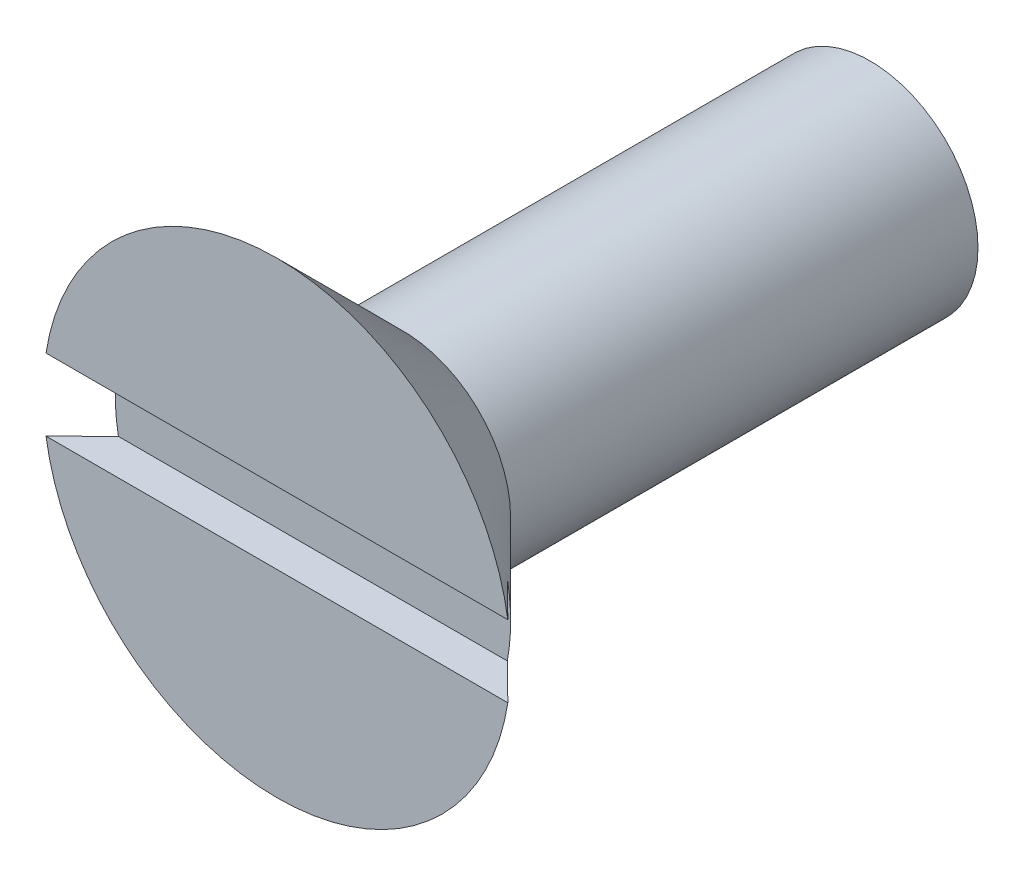
ISO-10303-21;
HEADER;
FILE_DESCRIPTION(('STEP AP214'),'2;1');
FILE_NAME('part.step','',(''),(''),'','','');
FILE_SCHEMA(('AUTOMOTIVE_DESIGN { 1 0 10303 214 1 1 1 1 }'));
ENDSEC;
DATA;
#1=APPLICATION_CONTEXT('core data for automotive mechanical design processes');
#2=APPLICATION_PROTOCOL_DEFINITION('international standard','automotive_design',2000,#1);
#3=PRODUCT_CONTEXT('',#1,'mechanical');
#4=PRODUCT('Part','Part','',(#3));
#5=PRODUCT_RELATED_PRODUCT_CATEGORY('part','',(#4));
#6=PRODUCT_DEFINITION_FORMATION('','',#4);
#7=PRODUCT_DEFINITION_CONTEXT('part definition',#1,'design');
#8=PRODUCT_DEFINITION('design','',#6,#7);
#9=PRODUCT_DEFINITION_SHAPE('','',#8);
#10=(LENGTH_UNIT() NAMED_UNIT(*) SI_UNIT(.MILLI.,.METRE.));
#11=(NAMED_UNIT(*) PLANE_ANGLE_UNIT() SI_UNIT($,.RADIAN.));
#12=(NAMED_UNIT(*) SI_UNIT($,.STERADIAN.) SOLID_ANGLE_UNIT());
#13=UNCERTAINTY_MEASURE_WITH_UNIT(LENGTH_MEASURE(1.E-05),#10,'distance_accuracy_value','');
#14=(GEOMETRIC_REPRESENTATION_CONTEXT(3) GLOBAL_UNCERTAINTY_ASSIGNED_CONTEXT((#13)) GLOBAL_UNIT_ASSIGNED_CONTEXT((#10,
#11,#12)) REPRESENTATION_CONTEXT('',''));
#15=CARTESIAN_POINT('',(0.,0.,0.));
#16=DIRECTION('',(0.,0.,1.));
#17=DIRECTION('',(1.,0.,0.));
#18=AXIS2_PLACEMENT_3D('',#15,#16,#17);
#19=CARTESIAN_POINT('',(-9.99200722162641E-13,6.49999999999817,8.03913925375888));
#20=DIRECTION('',(0.,0.,-0.999999999999993));
#21=DIRECTION('',(-0.999999999999994,0.,0.));
#22=AXIS2_PLACEMENT_3D('',#19,#20,#21);
#23=PLANE('',#22);
#24=CARTESIAN_POINT('',(0.,0.,8.03913925376121));
#25=DIRECTION('',(0.,0.,0.999999999999993));
#26=DIRECTION('',(0.999999999999994,0.,0.));
#27=AXIS2_PLACEMENT_3D('',#24,#25,#26);
#28=CIRCLE('',#27,6.5);
#29=CARTESIAN_POINT('',(-6.42261628933272,-1.00000000000211,8.03913925375888));
#30=VERTEX_POINT('',#29);
#31=CARTESIAN_POINT('',(6.42261628933272,-1.00000000000011,8.03913925376121));
#32=VERTEX_POINT('',#31);
#33=EDGE_CURVE('E130',#30,#32,#28,.T.);
#34=ORIENTED_EDGE('',*,*,#33,.T.);
#35=DIRECTION('',(-0.999999999999994,0.,0.));
#36=VECTOR('',#35,1.);
#37=CARTESIAN_POINT('',(-2.22044604925031E-13,-1.00000000000122,8.03913925376121));
#38=LINE('',#37,#36);
#39=EDGE_CURVE('E107',#32,#30,#38,.T.);
#40=ORIENTED_EDGE('',*,*,#39,.T.);
#41=EDGE_LOOP('',(#34,#40));
#42=FACE_BOUND('',#41,.T.);
#43=ADVANCED_FACE('F43',(#42),#23,.F.);
#44=CARTESIAN_POINT('',(0.,0.,-10.1929115538076));
#45=DIRECTION('',(0.,0.,0.999999999999993));
#46=DIRECTION('',(0.999999999999994,0.,0.));
#47=AXIS2_PLACEMENT_3D('',#44,#45,#46);
#48=CONICAL_SURFACE('',#47,0.,1.04719755119659);
#49=CARTESIAN_POINT('',(0.,0.,-8.46086074623875));
#50=DIRECTION('',(0.,0.,0.999999999999993));
#51=DIRECTION('',(0.999999999999994,0.,0.));
#52=AXIS2_PLACEMENT_3D('',#49,#50,#51);
#53=CIRCLE('',#52,3.);
#54=CARTESIAN_POINT('',(2.99999999999998,0.,-8.46086074623875));
#55=VERTEX_POINT('',#54);
#56=EDGE_CURVE('E117',#55,#55,#53,.T.);
#57=ORIENTED_EDGE('',*,*,#56,.F.);
#58=EDGE_LOOP('',(#57));
#59=FACE_BOUND('',#58,.T.);
#60=CARTESIAN_POINT('',(0.,0.,-10.1929115538076));
#61=VERTEX_POINT('',#60);
#62=VERTEX_LOOP('',#61);
#63=FACE_BOUND('',#62,.T.);
#64=ADVANCED_FACE('F44',(#59,#63),#48,.T.);
#65=CARTESIAN_POINT('',(0.,0.,15.2494033412888));
#66=DIRECTION('',(0.,0.,0.999999999999993));
#67=DIRECTION('',(0.999999999999994,0.,0.));
#68=AXIS2_PLACEMENT_3D('',#65,#66,#67);
#69=CYLINDRICAL_SURFACE('',#68,3.);
#70=CARTESIAN_POINT('',(0.,0.,4.53913925376126));
#71=DIRECTION('',(0.,0.,0.999999999999993));
#72=DIRECTION('',(0.999999999999994,0.,0.));
#73=AXIS2_PLACEMENT_3D('',#70,#71,#72);
#74=CIRCLE('',#73,3.);
#75=CARTESIAN_POINT('',(2.99999999999998,0.,4.53913925376126));
#76=VERTEX_POINT('',#75);
#77=EDGE_CURVE('E125',#76,#76,#74,.T.);
#78=CARTESIAN_POINT('',(2.99999999999998,0.,4.53913925376126));
#79=CARTESIAN_POINT('',(2.99999999999998,0.,4.40372258709459));
#80=CARTESIAN_POINT('',(2.99999999999998,0.,4.26830592042792));
#81=CARTESIAN_POINT('',(2.99999999999998,0.,3.99747258709459));
#82=CARTESIAN_POINT('',(2.99999999999998,0.,3.86205592042792));
#83=CARTESIAN_POINT('',(2.99999999999998,0.,3.59122258709459));
#84=CARTESIAN_POINT('',(2.99999999999998,0.,3.45580592042792));
#85=CARTESIAN_POINT('',(2.99999999999998,0.,3.18497258709459));
#86=CARTESIAN_POINT('',(2.99999999999998,0.,3.04955592042792));
#87=CARTESIAN_POINT('',(2.99999999999998,0.,2.77872258709459));
#88=CARTESIAN_POINT('',(2.99999999999998,0.,2.64330592042792));
#89=CARTESIAN_POINT('',(2.99999999999998,0.,2.37247258709459));
#90=CARTESIAN_POINT('',(2.99999999999998,0.,2.23705592042792));
#91=CARTESIAN_POINT('',(2.99999999999998,0.,1.96622258709459));
#92=CARTESIAN_POINT('',(2.99999999999998,0.,1.83080592042792));
#93=CARTESIAN_POINT('',(2.99999999999998,0.,1.55997258709459));
#94=CARTESIAN_POINT('',(2.99999999999998,0.,1.42455592042792));
#95=CARTESIAN_POINT('',(2.99999999999998,0.,1.15372258709459));
#96=CARTESIAN_POINT('',(2.99999999999998,0.,1.01830592042792));
#97=CARTESIAN_POINT('',(2.99999999999998,0.,0.747472587094589));
#98=CARTESIAN_POINT('',(2.99999999999998,0.,0.612055920427922));
#99=CARTESIAN_POINT('',(2.99999999999998,0.,0.341222587094588));
#100=CARTESIAN_POINT('',(2.99999999999998,0.,0.205805920427922));
#101=CARTESIAN_POINT('',(2.99999999999998,0.,-0.0650274129054112));
#102=CARTESIAN_POINT('',(2.99999999999998,0.,-0.200444079572078));
#103=CARTESIAN_POINT('',(2.99999999999998,0.,-0.471277412905412));
#104=CARTESIAN_POINT('',(2.99999999999998,0.,-0.606694079572078));
#105=CARTESIAN_POINT('',(2.99999999999998,0.,-0.877527412905412));
#106=CARTESIAN_POINT('',(2.99999999999998,0.,-1.01294407957208));
#107=CARTESIAN_POINT('',(2.99999999999998,0.,-1.28377741290541));
#108=CARTESIAN_POINT('',(2.99999999999998,0.,-1.41919407957208));
#109=CARTESIAN_POINT('',(2.99999999999998,0.,-1.69002741290541));
#110=CARTESIAN_POINT('',(2.99999999999998,0.,-1.82544407957208));
#111=CARTESIAN_POINT('',(2.99999999999998,0.,-2.09627741290541));
#112=CARTESIAN_POINT('',(2.99999999999998,0.,-2.23169407957208));
#113=CARTESIAN_POINT('',(2.99999999999998,0.,-2.50252741290541));
#114=CARTESIAN_POINT('',(2.99999999999998,0.,-2.63794407957208));
#115=CARTESIAN_POINT('',(2.99999999999998,0.,-2.90877741290541));
#116=CARTESIAN_POINT('',(2.99999999999998,0.,-3.04419407957208));
#117=CARTESIAN_POINT('',(2.99999999999998,0.,-3.31502741290541));
#118=CARTESIAN_POINT('',(2.99999999999998,0.,-3.45044407957208));
#119=CARTESIAN_POINT('',(2.99999999999998,0.,-3.72127741290541));
#120=CARTESIAN_POINT('',(2.99999999999998,0.,-3.85669407957208));
#121=CARTESIAN_POINT('',(2.99999999999998,0.,-4.12752741290542));
#122=CARTESIAN_POINT('',(2.99999999999998,0.,-4.26294407957208));
#123=CARTESIAN_POINT('',(2.99999999999998,0.,-4.53377741290542));
#124=CARTESIAN_POINT('',(2.99999999999998,0.,-4.66919407957209));
#125=CARTESIAN_POINT('',(2.99999999999998,0.,-4.94002741290542));
#126=CARTESIAN_POINT('',(2.99999999999998,0.,-5.07544407957208));
#127=CARTESIAN_POINT('',(2.99999999999998,0.,-5.34627741290542));
#128=CARTESIAN_POINT('',(2.99999999999998,0.,-5.48169407957208));
#129=CARTESIAN_POINT('',(2.99999999999998,0.,-5.75252741290542));
#130=CARTESIAN_POINT('',(2.99999999999998,0.,-5.88794407957208));
#131=CARTESIAN_POINT('',(2.99999999999998,0.,-6.15877741290542));
#132=CARTESIAN_POINT('',(2.99999999999998,0.,-6.29419407957208));
#133=CARTESIAN_POINT('',(2.99999999999998,0.,-6.56502741290542));
#134=CARTESIAN_POINT('',(2.99999999999998,0.,-6.70044407957208));
#135=CARTESIAN_POINT('',(2.99999999999998,0.,-6.97127741290541));
#136=CARTESIAN_POINT('',(2.99999999999998,0.,-7.10669407957208));
#137=CARTESIAN_POINT('',(2.99999999999998,0.,-7.37752741290542));
#138=CARTESIAN_POINT('',(2.99999999999998,0.,-7.51294407957208));
#139=CARTESIAN_POINT('',(2.99999999999998,0.,-7.78377741290542));
#140=CARTESIAN_POINT('',(2.99999999999998,0.,-7.91919407957208));
#141=CARTESIAN_POINT('',(2.99999999999998,0.,-8.19002741290542));
#142=CARTESIAN_POINT('',(2.99999999999998,0.,-8.32544407957208));
#143=CARTESIAN_POINT('',(2.99999999999998,0.,-8.46086074623875));
#144=B_SPLINE_CURVE_WITH_KNOTS('',3,(#78,#79,#80,#81,#82,#83,#84,#85,#86,#87,#88,#89,#90,#91,
#92,#93,#94,#95,#96,#97,#98,#99,#100,#101,#102,#103,#104,#105,#106,#107,#108,#109,#110,#111,
#112,#113,#114,#115,#116,#117,#118,#119,#120,#121,#122,#123,#124,#125,#126,#127,#128,#129,#130,
#131,#132,#133,#134,#135,#136,#137,#138,#139,#140,#141,#142,#143),.UNSPECIFIED.,.F.,.F.,(4,2,2,
2,2,2,2,2,2,2,2,2,2,2,2,2,2,2,2,2,2,2,2,2,2,2,2,2,2,2,2,2,4),(0.,0.40625,0.812499999999999,
1.21875,1.625,2.03125,2.4375,2.84375,3.25,3.65625,4.0625,4.46875,4.875,5.28125,5.6875,
6.09375000000001,6.5,6.90625,7.3125,7.71875000000001,8.12500000000001,8.53125000000001,
8.93750000000001,9.34375000000001,9.75000000000001,10.15625,10.5625,10.96875,11.375,11.78125,
12.1875,12.59375,13.),.UNSPECIFIED.);
#145=EDGE_CURVE('BSEAM165',#76,#55,#144,.T.);
#146=ORIENTED_EDGE('',*,*,#77,.F.);
#147=ORIENTED_EDGE('',*,*,#56,.T.);
#148=ORIENTED_EDGE('',*,*,#145,.T.);
#149=ORIENTED_EDGE('',*,*,#145,.F.);
#150=EDGE_LOOP('',(#146,#148,#147,#149));
#151=FACE_BOUND('',#150,.T.);
#152=ADVANCED_FACE('F165',(#151),#69,.T.);
#153=CARTESIAN_POINT('',(0.,0.,4.53913925376126));
#154=DIRECTION('',(0.,0.,0.999999999999993));
#155=DIRECTION('',(0.999999999999994,0.,0.));
#156=AXIS2_PLACEMENT_3D('',#153,#154,#155);
#157=CONICAL_SURFACE('',#156,3.,0.785398163397453);
#158=CARTESIAN_POINT('',(0.,0.,7.03913925376121));
#159=DIRECTION('',(0.,0.,-0.999999999999993));
#160=DIRECTION('',(0.,0.999999999999994,0.));
#161=AXIS2_PLACEMENT_3D('',#158,#159,#160);
#162=CIRCLE('',#161,5.49999999999999);
#163=CARTESIAN_POINT('',(5.4083269131957,0.99999999999989,7.03913925376121));
#164=VERTEX_POINT('',#163);
#165=CARTESIAN_POINT('',(5.4083269131957,-0.999999999999668,7.03913925376121));
#166=VERTEX_POINT('',#165);
#167=EDGE_CURVE('E11',#164,#166,#162,.T.);
#168=ORIENTED_EDGE('',*,*,#167,.T.);
#169=CARTESIAN_POINT('',(-6.42332472244744,-1.00000000000011,8.03983925375884));
#170=CARTESIAN_POINT('',(-6.23660097945416,-1.00000000000054,7.85534676102938));
#171=CARTESIAN_POINT('',(-6.04979042026789,-1.00000000000071,7.67094198825894));
#172=CARTESIAN_POINT('',(-5.67580075194475,-1.00000000000084,7.30227192349925));
#173=CARTESIAN_POINT('',(-5.48862148517455,-1.0000000000008,7.11800679144043));
#174=CARTESIAN_POINT('',(-5.11174427199976,-1.00000000000076,6.74766036903494));
#175=CARTESIAN_POINT('',(-4.92204245247799,-1.00000000000077,6.56158301675637));
#176=CARTESIAN_POINT('',(-4.54228085926294,-1.00000000000078,6.19003078337768));
#177=CARTESIAN_POINT('',(-4.35222138163341,-1.00000000000078,6.00455559951607));
#178=CARTESIAN_POINT('',(-3.89448779308274,-1.00000000000078,5.55946502690143));
#179=CARTESIAN_POINT('',(-3.62648996292858,-1.00000000000078,5.30018132198132));
#180=CARTESIAN_POINT('',(-3.22235847326496,-1.00000000000078,4.91288337078818));
#181=CARTESIAN_POINT('',(-3.08714155543628,-1.00000000000078,4.7839136838758));
#182=CARTESIAN_POINT('',(-2.81583986260167,-1.00000000000078,4.52695574753417));
#183=CARTESIAN_POINT('',(-2.67975530664879,-1.00000000000078,4.39896726705464));
#184=CARTESIAN_POINT('',(-2.40750996464795,-1.00000000000078,4.14559592917667));
#185=CARTESIAN_POINT('',(-2.27136147506082,-1.00000000000078,4.02019992564155));
#186=CARTESIAN_POINT('',(-2.0654925185218,-1.00000000000078,3.83379070044307));
#187=CARTESIAN_POINT('',(-1.99656195550278,-1.00000000000078,3.77190603017397));
#188=CARTESIAN_POINT('',(-1.85800765522095,-1.00000000000078,3.64891860651755));
#189=CARTESIAN_POINT('',(-1.78838393254497,-1.00000000000078,3.58781583673755));
#190=CARTESIAN_POINT('',(-1.64849944827692,-1.00000000000078,3.46691427534895));
#191=CARTESIAN_POINT('',(-1.57824237330103,-1.00000000000079,3.40711122880455));
#192=CARTESIAN_POINT('',(-1.43649465507045,-1.00000000000077,3.28898973831806));
#193=CARTESIAN_POINT('',(-1.36500413120591,-1.00000000000074,3.23067115202712));
#194=CARTESIAN_POINT('',(-1.22040224759305,-1.00000000000081,3.11629610643475));
#195=CARTESIAN_POINT('',(-1.14729345020491,-1.00000000000091,3.06023641902598));
#196=CARTESIAN_POINT('',(-0.998633654183824,-1.00000000000064,2.95147065672692));
#197=CARTESIAN_POINT('',(-0.923084175169175,-1.00000000000027,2.89876255352558));
#198=CARTESIAN_POINT('',(-0.826733268003507,-1.00000000000063,2.8365529452797));
#199=CARTESIAN_POINT('',(-0.807613449629322,-1.00000000000074,2.82444553403773));
#200=CARTESIAN_POINT('',(-0.769130032510011,-1.00000000000082,2.80061918446699));
#201=CARTESIAN_POINT('',(-0.749766402677136,-1.0000000000008,2.78890029638424));
#202=CARTESIAN_POINT('',(-0.691277443856296,-1.00000000000074,2.75440512313443));
#203=CARTESIAN_POINT('',(-0.651756012111228,-1.00000000000074,2.73229161269446));
#204=CARTESIAN_POINT('',(-0.571795836460958,-1.00000000000082,2.69057194122216));
#205=CARTESIAN_POINT('',(-0.531366913060111,-1.0000000000009,2.67094720255315));
#206=CARTESIAN_POINT('',(-0.449164527119024,-1.00000000000065,2.63476074145419));
#207=CARTESIAN_POINT('',(-0.407391476630586,-1.00000000000031,2.61819809062667));
#208=CARTESIAN_POINT('',(-0.306630339617464,-1.00000000000036,2.58366516586201));
#209=CARTESIAN_POINT('',(-0.247006700384382,-1.00000000000106,2.5674535803962));
#210=CARTESIAN_POINT('',(-0.125997310764632,-1.0000000000005,2.54531054226916));
#211=CARTESIAN_POINT('',(-0.0646188656950788,-0.999999999999249,2.53934141686901));
#212=CARTESIAN_POINT('',(0.0584045004397683,-0.999999999999198,2.53894673512822));
#213=CARTESIAN_POINT('',(0.120049577221961,-1.00000000000041,2.54456334160745));
#214=CARTESIAN_POINT('',(0.241594604406187,-1.00000000000115,2.56614874808371));
#215=CARTESIAN_POINT('',(0.301487895030872,-1.00000000000068,2.58215274603149));
#216=CARTESIAN_POINT('',(0.42325524859493,-1.00000000000042,2.62338469768493));
#217=CARTESIAN_POINT('',(0.484904761597966,-1.00000000000068,2.64924787452346));
#218=CARTESIAN_POINT('',(0.6054043752899,-1.00000000000088,2.70691868930472));
#219=CARTESIAN_POINT('',(0.664248833758711,-1.00000000000083,2.7387377224141));
#220=CARTESIAN_POINT('',(0.780076722375689,-1.00000000000073,2.80653819408482));
#221=CARTESIAN_POINT('',(0.837041711977087,-1.00000000000068,2.84255061623321));
#222=CARTESIAN_POINT('',(0.921108655797155,-1.00000000000083,2.8985544596058));
#223=CARTESIAN_POINT('',(0.948889451469115,-1.00000000000092,2.9175448464806));
#224=CARTESIAN_POINT('',(1.0040579150828,-1.00000000000064,2.95608755923686));
#225=CARTESIAN_POINT('',(1.03144559433594,-1.00000000000026,2.97563986890092));
#226=CARTESIAN_POINT('',(1.11814350021916,-0.99999999999978,3.03866221706228));
#227=CARTESIAN_POINT('',(1.17681365370868,-1.0000000000005,3.08301224194803));
#228=CARTESIAN_POINT('',(1.29294612386728,-1.00000000000105,3.17327088499474));
#229=CARTESIAN_POINT('',(1.35040825171687,-1.00000000000087,3.21917974391814));
#230=CARTESIAN_POINT('',(1.52148386035096,-1.00000000000059,3.35861619803651));
#231=CARTESIAN_POINT('',(1.63373305297608,-1.00000000000073,3.45381342478757));
#232=CARTESIAN_POINT('',(1.85622604953486,-1.00000000000083,3.64687912396361));
#233=CARTESIAN_POINT('',(1.96646600221115,-1.00000000000079,3.7447519776395));
#234=CARTESIAN_POINT('',(2.18547633450436,-1.00000000000077,3.94206481918481));
#235=CARTESIAN_POINT('',(2.29424711666532,-1.00000000000078,4.04150436092167));
#236=CARTESIAN_POINT('',(2.51044729255184,-1.00000000000078,4.2411077538368));
#237=CARTESIAN_POINT('',(2.61787995144352,-1.00000000000076,4.34126808027833));
#238=CARTESIAN_POINT('',(2.83205668510629,-1.00000000000079,4.54233637358067));
#239=CARTESIAN_POINT('',(2.93880071115563,-1.00000000000084,4.6432443922797));
#240=CARTESIAN_POINT('',(3.25807348248296,-1.00000000000066,4.94657019807098));
#241=CARTESIAN_POINT('',(3.46984818145653,-1.00000000000015,5.14978089263227));
#242=CARTESIAN_POINT('',(3.91117980862627,-1.00000000000007,5.57569047400246));
#243=CARTESIAN_POINT('',(4.14062755160395,-1.00000000000059,5.79850215421029));
#244=CARTESIAN_POINT('',(4.59874114188712,-1.00000000000097,6.24507418093253));
#245=CARTESIAN_POINT('',(4.82740671438498,-1.00000000000082,6.46883480916321));
#246=CARTESIAN_POINT('',(5.28420548160954,-1.00000000000073,6.91695072967438));
#247=CARTESIAN_POINT('',(5.51233861215075,-1.00000000000079,7.1413060873244));
#248=CARTESIAN_POINT('',(5.96812929258557,-1.00000000000076,7.59034717735258));
#249=CARTESIAN_POINT('',(6.19578697599701,-1.00000000000067,7.81503277417376));
#250=CARTESIAN_POINT('',(6.42332472244656,-1.00000000000033,8.03983925376117));
#251=B_SPLINE_CURVE_WITH_KNOTS('',3,(#169,#170,#171,#172,#173,#174,#175,#176,#177,#178,#179,
#180,#181,#182,#183,#184,#185,#186,#187,#188,#189,#190,#191,#192,#193,#194,#195,#196,#197,#198,
#199,#200,#201,#202,#203,#204,#205,#206,#207,#208,#209,#210,#211,#212,#213,#214,#215,#216,#217,
#218,#219,#220,#221,#222,#223,#224,#225,#226,#227,#228,#229,#230,#231,#232,#233,#234,#235,#236,
#237,#238,#239,#240,#241,#242,#243,#244,#245,#246,#247,#248,#249,#250),.UNSPECIFIED.,.F.,.F.,(4,
2,2,2,2,2,2,2,2,2,2,2,2,2,2,2,2,2,2,2,2,2,2,2,2,2,2,2,2,2,2,2,2,2,2,2,2,2,2,2,4),(0.,
0.787482879089131,1.57545946981692,2.37264371237048,3.16933207456495,4.28800672997407,
4.8485845681067,5.40902607813697,5.96429483881357,6.242193934429,6.52008719425952,
6.7968631902522,7.07361254470221,7.34995126360751,7.62612112424135,7.69400967717261,
7.7619069758615,7.89770861285861,8.0324279907205,8.16710645564989,8.35176568840563,
8.53574425942048,8.7203935467221,8.90567181281824,9.10576489619387,9.30624479924197,
9.50831322810938,9.60926230610147,9.71020847356574,9.93080591781436,10.1514375897942,
10.5929016423186,11.0351379005529,11.4772504248625,11.9178874921836,12.358555400606,
13.2390498022823,14.1985373102625,15.1583329960914,16.1182389566274,17.0778239415896),.UNSPECIFIED.);
#252=EDGE_CURVE('E128',#166,#32,#251,.T.);
#253=ORIENTED_EDGE('',*,*,#252,.T.);
#254=ORIENTED_EDGE('',*,*,#33,.F.);
#255=CARTESIAN_POINT('',(-5.40832691319648,-1.00000000000056,7.03913925375887));
#256=VERTEX_POINT('',#255);
#257=EDGE_CURVE('E106',#30,#256,#251,.T.);
#258=ORIENTED_EDGE('',*,*,#257,.T.);
#259=CARTESIAN_POINT('',(-5.40832691319548,0.999999999999224,7.03913925375643));
#260=VERTEX_POINT('',#259);
#261=EDGE_CURVE('E50',#256,#260,#162,.T.);
#262=ORIENTED_EDGE('',*,*,#261,.T.);
#263=CARTESIAN_POINT('',(6.42332472244678,0.999999999998558,8.03983925376117));
#264=CARTESIAN_POINT('',(6.2366009794535,0.9999999999987,7.8553467610296));
#265=CARTESIAN_POINT('',(6.04979042026662,0.999999999998758,7.67094198825767));
#266=CARTESIAN_POINT('',(5.67580075194171,0.999999999998801,7.30227192349559));
#267=CARTESIAN_POINT('',(5.48862148517036,0.999999999998786,7.11800679143586));
#268=CARTESIAN_POINT('',(5.11174427199365,0.999999999998774,6.74766036902864));
#269=CARTESIAN_POINT('',(4.92204245247113,0.999999999998778,6.56158301674926));
#270=CARTESIAN_POINT('',(4.54228085925451,0.999999999998781,6.190030783369));
#271=CARTESIAN_POINT('',(4.35222138162417,0.99999999999878,6.00455559950661));
#272=CARTESIAN_POINT('',(3.89448779307357,0.999999999998779,5.55946502689206));
#273=CARTESIAN_POINT('',(3.6264899629203,0.999999999998779,5.30018132197281));
#274=CARTESIAN_POINT('',(3.22235847325803,0.99999999999878,4.91288337078098));
#275=CARTESIAN_POINT('',(3.08714155542984,0.99999999999878,4.78391368386906));
#276=CARTESIAN_POINT('',(2.81583986259616,0.999999999998779,4.52695574752832));
#277=CARTESIAN_POINT('',(2.67975530664375,0.999999999998779,4.39896726704923));
#278=CARTESIAN_POINT('',(2.40750996464363,0.999999999998781,4.14559592917192));
#279=CARTESIAN_POINT('',(2.27136147505674,0.999999999998783,4.02019992563701));
#280=CARTESIAN_POINT('',(2.06549251851811,0.999999999998778,3.83379070043888));
#281=CARTESIAN_POINT('',(1.99656195549923,0.999999999998775,3.7719060301699));
#282=CARTESIAN_POINT('',(1.85800765521769,0.999999999998785,3.64891860651373));
#283=CARTESIAN_POINT('',(1.78838393254184,0.999999999998798,3.58781583673385));
#284=CARTESIAN_POINT('',(1.64849944827406,0.999999999998761,3.46691427534546));
#285=CARTESIAN_POINT('',(1.57824237329829,0.999999999998711,3.40711122880114));
#286=CARTESIAN_POINT('',(1.43649465506792,0.999999999998848,3.28898973831486));
#287=CARTESIAN_POINT('',(1.36500413120346,0.999999999999036,3.23067115202407));
#288=CARTESIAN_POINT('',(1.22040224759089,0.999999999998524,3.11629610643172));
#289=CARTESIAN_POINT('',(1.14729345020295,0.999999999997826,3.06023641902284));
#290=CARTESIAN_POINT('',(0.998633654181701,0.999999999999732,2.95147065672435));
#291=CARTESIAN_POINT('',(0.923084175166687,1.00000000000233,2.8987625535237));
#292=CARTESIAN_POINT('',(0.82673326800148,0.999999999999842,2.83655294527724));
#293=CARTESIAN_POINT('',(0.807613449627421,0.999999999999072,2.82444553403509));
#294=CARTESIAN_POINT('',(0.769130032508218,0.999999999998487,2.8006191844642));
#295=CARTESIAN_POINT('',(0.749766402675326,0.999999999998672,2.7889002963815));
#296=CARTESIAN_POINT('',(0.691277443854502,0.999999999998995,2.75440512313187));
#297=CARTESIAN_POINT('',(0.651756012109484,0.999999999998902,2.73229161269205));
#298=CARTESIAN_POINT('',(0.571795836459474,0.999999999998658,2.69057194121948));
#299=CARTESIAN_POINT('',(0.531366913058835,0.999999999998507,2.67094720255008));
#300=CARTESIAN_POINT('',(0.449164527117314,0.999999999999052,2.63476074145236));
#301=CARTESIAN_POINT('',(0.407391476628231,0.999999999999747,2.61819809062648));
#302=CARTESIAN_POINT('',(0.306630339614743,1.00000000000009,2.58366516586231));
#303=CARTESIAN_POINT('',(0.247006700382336,0.999999999999244,2.56745358039404));
#304=CARTESIAN_POINT('',(0.125997310763055,0.999999999998317,2.54531054226673));
#305=CARTESIAN_POINT('',(0.0646188656932991,0.99999999999823,2.53934141686874));
#306=CARTESIAN_POINT('',(-0.0584045004420313,0.999999999998442,2.53894673512849));
#307=CARTESIAN_POINT('',(-0.120049577224504,0.999999999998742,2.54456334160614));
#308=CARTESIAN_POINT('',(-0.241594604409013,0.999999999998817,2.56614874808204));
#309=CARTESIAN_POINT('',(-0.301487895033701,0.999999999998589,2.58215274603105));
#310=CARTESIAN_POINT('',(-0.423255248597992,0.999999999998523,2.62338469768536));
#311=CARTESIAN_POINT('',(-0.484904761601293,0.999999999998717,2.6492478745234));
#312=CARTESIAN_POINT('',(-0.605404375293358,0.999999999998842,2.70691868930452));
#313=CARTESIAN_POINT('',(-0.664248833762039,0.999999999998772,2.73873772241426));
#314=CARTESIAN_POINT('',(-0.780076722378956,0.999999999998787,2.80653819408528));
#315=CARTESIAN_POINT('',(-0.837041711980423,0.999999999998875,2.8425506162336));
#316=CARTESIAN_POINT('',(-0.921108655800303,0.999999999998732,2.89855445960657));
#317=CARTESIAN_POINT('',(-0.94888945147216,0.999999999998639,2.91754484648158));
#318=CARTESIAN_POINT('',(-1.00405791508618,0.99999999999892,2.95608755923751));
#319=CARTESIAN_POINT('',(-1.03144559433976,0.999999999999294,2.97563986890101));
#320=CARTESIAN_POINT('',(-1.11814350022349,0.999999999999778,3.03866221706169));
#321=CARTESIAN_POINT('',(-1.1768136537121,0.999999999999053,3.08301224194866));
#322=CARTESIAN_POINT('',(-1.29294612386999,0.999999999998506,3.17327088499636));
#323=CARTESIAN_POINT('',(-1.35040825171977,0.999999999998684,3.21917974391953));
#324=CARTESIAN_POINT('',(-1.52148386035419,0.999999999998971,3.35861619803761));
#325=CARTESIAN_POINT('',(-1.63373305297914,0.999999999998831,3.45381342478901));
#326=CARTESIAN_POINT('',(-1.85622604953782,0.999999999998729,3.6468791239654));
#327=CARTESIAN_POINT('',(-1.96646600221415,0.999999999998767,3.74475197764131));
#328=CARTESIAN_POINT('',(-2.18547633450739,0.999999999998792,3.94206481918671));
#329=CARTESIAN_POINT('',(-2.29424711666834,0.999999999998779,4.04150436092363));
#330=CARTESIAN_POINT('',(-2.51044729255488,0.99999999999878,4.2411077538389));
#331=CARTESIAN_POINT('',(-2.61787995144662,0.999999999998794,4.34126808028049));
#332=CARTESIAN_POINT('',(-2.83205668510945,0.999999999998765,4.54233637358301));
#333=CARTESIAN_POINT('',(-2.9388007111588,0.999999999998723,4.64324439228216));
#334=CARTESIAN_POINT('',(-3.25807348248641,0.999999999998894,4.9465701980735));
#335=CARTESIAN_POINT('',(-3.46984818146051,0.999999999999406,5.14978089263449));
#336=CARTESIAN_POINT('',(-3.91117980863008,0.999999999999489,5.57569047400449));
#337=CARTESIAN_POINT('',(-4.140627551607,0.999999999998969,5.79850215421249));
#338=CARTESIAN_POINT('',(-4.59874114188925,0.99999999999859,6.24507418093448));
#339=CARTESIAN_POINT('',(-4.82740671438693,0.999999999998731,6.46883480916473));
#340=CARTESIAN_POINT('',(-5.28420548161084,0.999999999998828,6.91695072967527));
#341=CARTESIAN_POINT('',(-5.51233861215156,0.999999999998786,7.14130608732508));
#342=CARTESIAN_POINT('',(-5.9681292925859,0.999999999998774,7.59034717735234));
#343=CARTESIAN_POINT('',(-6.19578697599736,0.999999999998805,7.8150327741728));
#344=CARTESIAN_POINT('',(-6.42332472244755,0.999999999999002,8.03983925375884));
#345=B_SPLINE_CURVE_WITH_KNOTS('',3,(#263,#264,#265,#266,#267,#268,#269,#270,#271,#272,#273,
#274,#275,#276,#277,#278,#279,#280,#281,#282,#283,#284,#285,#286,#287,#288,#289,#290,#291,#292,
#293,#294,#295,#296,#297,#298,#299,#300,#301,#302,#303,#304,#305,#306,#307,#308,#309,#310,#311,
#312,#313,#314,#315,#316,#317,#318,#319,#320,#321,#322,#323,#324,#325,#326,#327,#328,#329,#330,
#331,#332,#333,#334,#335,#336,#337,#338,#339,#340,#341,#342,#343,#344),.UNSPECIFIED.,.F.,.F.,(4,
2,2,2,2,2,2,2,2,2,2,2,2,2,2,2,2,2,2,2,2,2,2,2,2,2,2,2,2,2,2,2,2,2,2,2,2,2,2,2,4),(0.,
0.787482879093562,1.57545946982574,2.37264371238263,3.16933207458045,4.28800672998587,
4.84858456811653,5.40902607814487,5.96429483882048,6.24219393443535,6.52008719426532,
6.79686319025754,7.07361254470713,7.34995126361211,7.62612112424572,7.69400967717696,
7.76190697586582,7.89770861286267,8.03242799072436,8.1671064556539,8.35176568840951,
8.53574425942422,8.72039354672649,8.90567181282332,9.10576489619931,9.30624479924748,
9.508313228115,9.60926230610719,9.71020847357157,9.93080591782016,10.1514375898001,
10.5929016423246,11.0351379005591,11.4772504248689,11.9178874921902,12.3585554006128,
13.2390498022897,14.1985373102686,15.1583329960962,16.1182389566308,17.0778239415915),.UNSPECIFIED.);
#346=CARTESIAN_POINT('',(-6.42261628933238,0.999999999999446,8.03913925375888));
#347=VERTEX_POINT('',#346);
#348=EDGE_CURVE('E81',#260,#347,#345,.T.);
#349=ORIENTED_EDGE('',*,*,#348,.T.);
#350=CARTESIAN_POINT('',(6.42261628933227,0.999999999998558,8.03913925376121));
#351=VERTEX_POINT('',#350);
#352=EDGE_CURVE('E127',#351,#347,#28,.T.);
#353=ORIENTED_EDGE('',*,*,#352,.F.);
#354=EDGE_CURVE('E56',#351,#164,#345,.T.);
#355=ORIENTED_EDGE('',*,*,#354,.T.);
#356=EDGE_LOOP('',(#168,#253,#254,#258,#262,#349,#353,#355));
#357=FACE_BOUND('',#356,.T.);
#358=ORIENTED_EDGE('',*,*,#77,.T.);
#359=EDGE_LOOP('',(#358));
#360=FACE_BOUND('',#359,.T.);
#361=ADVANCED_FACE('F103',(#357,#360),#157,.T.);
#362=ORIENTED_EDGE('',*,*,#352,.T.);
#363=DIRECTION('',(0.999999999999994,0.,0.));
#364=VECTOR('',#363,1.);
#365=CARTESIAN_POINT('',(-5.55111512312578E-13,0.999999999999446,8.03913925376121));
#366=LINE('',#365,#364);
#367=EDGE_CURVE('E86',#347,#351,#366,.T.);
#368=ORIENTED_EDGE('',*,*,#367,.T.);
#369=EDGE_LOOP('',(#362,#368));
#370=FACE_BOUND('',#369,.T.);
#371=ADVANCED_FACE('F152',(#370),#23,.F.);
#372=CARTESIAN_POINT('',(-6.49999999999984,0.999999999999002,7.03913925375887));
#373=DIRECTION('',(0.,0.,-0.999999999999993));
#374=DIRECTION('',(0.,0.999999999999994,0.));
#375=AXIS2_PLACEMENT_3D('',#372,#373,#374);
#376=PLANE('',#375);
#377=DIRECTION('',(0.999999999999994,0.,0.));
#378=VECTOR('',#377,1.);
#379=CARTESIAN_POINT('',(-6.49999999999984,0.999999999999002,7.03913925375887));
#380=LINE('',#379,#378);
#381=EDGE_CURVE('E87',#260,#164,#380,.T.);
#382=ORIENTED_EDGE('',*,*,#381,.F.);
#383=ORIENTED_EDGE('',*,*,#261,.F.);
#384=DIRECTION('',(0.999999999999994,0.,0.));
#385=VECTOR('',#384,1.);
#386=CARTESIAN_POINT('',(-6.49999999999928,-1.00000000000033,7.03913925375887));
#387=LINE('',#386,#385);
#388=EDGE_CURVE('E94',#256,#166,#387,.T.);
#389=ORIENTED_EDGE('',*,*,#388,.T.);
#390=ORIENTED_EDGE('',*,*,#167,.F.);
#391=EDGE_LOOP('',(#382,#383,#389,#390));
#392=FACE_BOUND('',#391,.T.);
#393=ADVANCED_FACE('F100',(#392),#376,.F.);
#394=CARTESIAN_POINT('',(-6.49999999999984,-1.00000000000078,9.03913925375888));
#395=DIRECTION('',(0.,-0.999999999999994,0.));
#396=DIRECTION('',(0.,0.,-0.999999999999993));
#397=AXIS2_PLACEMENT_3D('',#394,#395,#396);
#398=PLANE('',#397);
#399=ORIENTED_EDGE('',*,*,#39,.F.);
#400=ORIENTED_EDGE('',*,*,#252,.F.);
#401=ORIENTED_EDGE('',*,*,#388,.F.);
#402=ORIENTED_EDGE('',*,*,#257,.F.);
#403=EDGE_LOOP('',(#399,#400,#401,#402));
#404=FACE_BOUND('',#403,.T.);
#405=ADVANCED_FACE('F148',(#404),#398,.F.);
#406=CARTESIAN_POINT('',(-6.50000000000028,0.99999999999878,9.03913925375888));
#407=DIRECTION('',(0.,0.999999999999994,0.));
#408=DIRECTION('',(0.,0.,0.999999999999993));
#409=AXIS2_PLACEMENT_3D('',#406,#407,#408);
#410=PLANE('',#409);
#411=ORIENTED_EDGE('',*,*,#367,.F.);
#412=ORIENTED_EDGE('',*,*,#348,.F.);
#413=ORIENTED_EDGE('',*,*,#381,.T.);
#414=ORIENTED_EDGE('',*,*,#354,.F.);
#415=EDGE_LOOP('',(#411,#412,#413,#414));
#416=FACE_BOUND('',#415,.T.);
#417=ADVANCED_FACE('F88',(#416),#410,.F.);
#418=CLOSED_SHELL('',(#43,#64,#152,#361,#371,#393,#405,#417));
#419=MANIFOLD_SOLID_BREP('B2',#418);
#420=ADVANCED_BREP_SHAPE_REPRESENTATION('',(#18,#419),#14);
#421=SHAPE_DEFINITION_REPRESENTATION(#9,#420);
ENDSEC;
END-ISO-10303-21;
